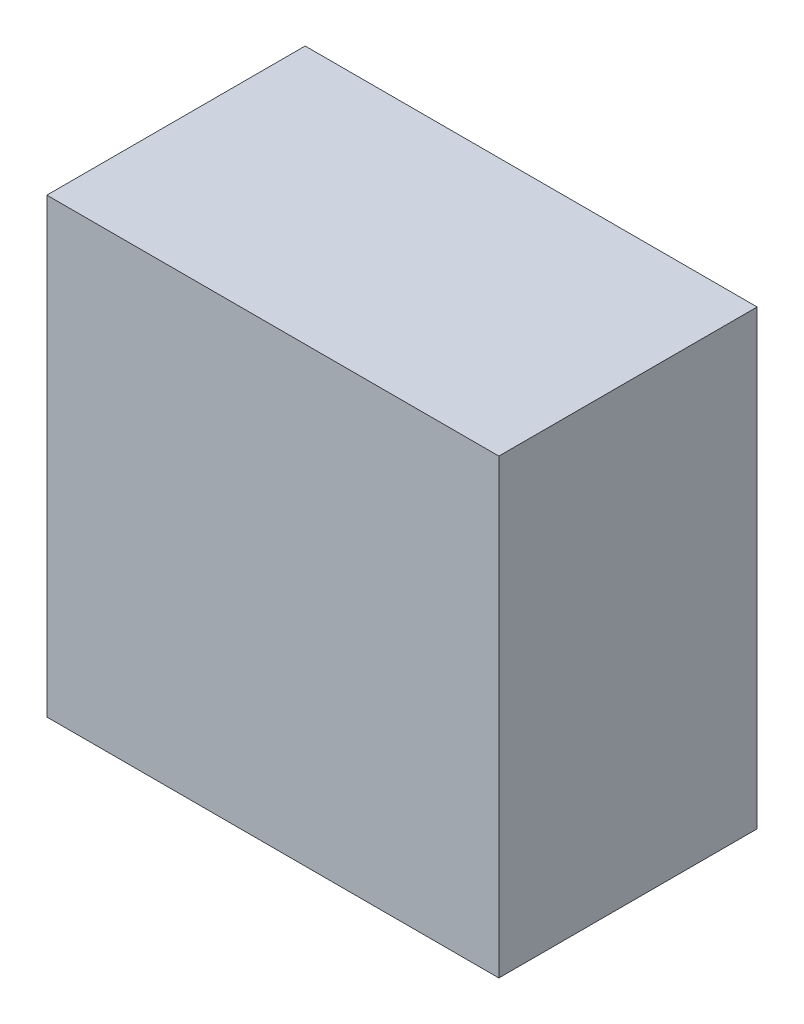
ISO-10303-21;
HEADER;
FILE_DESCRIPTION(('STEP AP214'),'2;1');
FILE_NAME('part.step','',(''),(''),'','','');
FILE_SCHEMA(('AUTOMOTIVE_DESIGN { 1 0 10303 214 1 1 1 1 }'));
ENDSEC;
DATA;
#1=APPLICATION_CONTEXT('core data for automotive mechanical design processes');
#2=APPLICATION_PROTOCOL_DEFINITION('international standard','automotive_design',2000,#1);
#3=PRODUCT_CONTEXT('',#1,'mechanical');
#4=PRODUCT('Part','Part','',(#3));
#5=PRODUCT_RELATED_PRODUCT_CATEGORY('part','',(#4));
#6=PRODUCT_DEFINITION_FORMATION('','',#4);
#7=PRODUCT_DEFINITION_CONTEXT('part definition',#1,'design');
#8=PRODUCT_DEFINITION('design','',#6,#7);
#9=PRODUCT_DEFINITION_SHAPE('','',#8);
#10=(LENGTH_UNIT() NAMED_UNIT(*) SI_UNIT(.MILLI.,.METRE.));
#11=(NAMED_UNIT(*) PLANE_ANGLE_UNIT() SI_UNIT($,.RADIAN.));
#12=(NAMED_UNIT(*) SI_UNIT($,.STERADIAN.) SOLID_ANGLE_UNIT());
#13=UNCERTAINTY_MEASURE_WITH_UNIT(LENGTH_MEASURE(1.E-05),#10,'distance_accuracy_value','');
#14=(GEOMETRIC_REPRESENTATION_CONTEXT(3) GLOBAL_UNCERTAINTY_ASSIGNED_CONTEXT((#13)) GLOBAL_UNIT_ASSIGNED_CONTEXT((#10,
#11,#12)) REPRESENTATION_CONTEXT('',''));
#15=CARTESIAN_POINT('',(0.,0.,0.));
#16=DIRECTION('',(0.,0.,1.));
#17=DIRECTION('',(1.,0.,0.));
#18=AXIS2_PLACEMENT_3D('',#15,#16,#17);
#19=CARTESIAN_POINT('',(-70.,70.,80.));
#20=DIRECTION('',(1.,0.,0.));
#21=DIRECTION('',(0.,0.,-1.));
#22=AXIS2_PLACEMENT_3D('',#19,#20,#21);
#23=PLANE('',#22);
#24=DIRECTION('',(0.,-1.,0.));
#25=VECTOR('',#24,1.);
#26=CARTESIAN_POINT('',(-70.,70.,0.));
#27=LINE('',#26,#25);
#28=CARTESIAN_POINT('',(-70.,70.,0.));
#29=VERTEX_POINT('',#28);
#30=CARTESIAN_POINT('',(-70.,-70.,0.));
#31=VERTEX_POINT('',#30);
#32=EDGE_CURVE('E83',#29,#31,#27,.T.);
#33=ORIENTED_EDGE('',*,*,#32,.T.);
#34=DIRECTION('',(0.,0.,-1.));
#35=VECTOR('',#34,1.);
#36=CARTESIAN_POINT('',(-70.,-70.,80.));
#37=LINE('',#36,#35);
#38=CARTESIAN_POINT('',(-70.,-70.,80.));
#39=VERTEX_POINT('',#38);
#40=EDGE_CURVE('E11',#39,#31,#37,.T.);
#41=ORIENTED_EDGE('',*,*,#40,.F.);
#42=DIRECTION('',(0.,-1.,0.));
#43=VECTOR('',#42,1.);
#44=CARTESIAN_POINT('',(-70.,70.,80.));
#45=LINE('',#44,#43);
#46=CARTESIAN_POINT('',(-70.,70.,80.));
#47=VERTEX_POINT('',#46);
#48=EDGE_CURVE('E69',#47,#39,#45,.T.);
#49=ORIENTED_EDGE('',*,*,#48,.F.);
#50=DIRECTION('',(0.,0.,-1.));
#51=VECTOR('',#50,1.);
#52=CARTESIAN_POINT('',(-70.,70.,80.));
#53=LINE('',#52,#51);
#54=EDGE_CURVE('E77',#47,#29,#53,.T.);
#55=ORIENTED_EDGE('',*,*,#54,.T.);
#56=EDGE_LOOP('',(#33,#41,#49,#55));
#57=FACE_BOUND('',#56,.T.);
#58=ADVANCED_FACE('F18',(#57),#23,.F.);
#59=CARTESIAN_POINT('',(-70.,-70.,80.));
#60=DIRECTION('',(0.,1.,0.));
#61=DIRECTION('',(0.,0.,1.));
#62=AXIS2_PLACEMENT_3D('',#59,#60,#61);
#63=PLANE('',#62);
#64=DIRECTION('',(1.,0.,0.));
#65=VECTOR('',#64,1.);
#66=CARTESIAN_POINT('',(-70.,-70.,0.));
#67=LINE('',#66,#65);
#68=CARTESIAN_POINT('',(70.,-70.,0.));
#69=VERTEX_POINT('',#68);
#70=EDGE_CURVE('E73',#31,#69,#67,.T.);
#71=ORIENTED_EDGE('',*,*,#70,.T.);
#72=DIRECTION('',(0.,0.,-1.));
#73=VECTOR('',#72,1.);
#74=CARTESIAN_POINT('',(70.,-70.,80.));
#75=LINE('',#74,#73);
#76=CARTESIAN_POINT('',(70.,-70.,80.));
#77=VERTEX_POINT('',#76);
#78=EDGE_CURVE('E26',#77,#69,#75,.T.);
#79=ORIENTED_EDGE('',*,*,#78,.F.);
#80=DIRECTION('',(1.,0.,0.));
#81=VECTOR('',#80,1.);
#82=CARTESIAN_POINT('',(-70.,-70.,80.));
#83=LINE('',#82,#81);
#84=EDGE_CURVE('E64',#39,#77,#83,.T.);
#85=ORIENTED_EDGE('',*,*,#84,.F.);
#86=ORIENTED_EDGE('',*,*,#40,.T.);
#87=EDGE_LOOP('',(#71,#79,#85,#86));
#88=FACE_BOUND('',#87,.T.);
#89=ADVANCED_FACE('F72',(#88),#63,.F.);
#90=CARTESIAN_POINT('',(70.,-70.,80.));
#91=DIRECTION('',(-1.,0.,0.));
#92=DIRECTION('',(0.,-1.,0.));
#93=AXIS2_PLACEMENT_3D('',#90,#91,#92);
#94=PLANE('',#93);
#95=DIRECTION('',(0.,1.,0.));
#96=VECTOR('',#95,1.);
#97=CARTESIAN_POINT('',(70.,-70.,0.));
#98=LINE('',#97,#96);
#99=CARTESIAN_POINT('',(70.,70.,0.));
#100=VERTEX_POINT('',#99);
#101=EDGE_CURVE('E51',#69,#100,#98,.T.);
#102=ORIENTED_EDGE('',*,*,#101,.T.);
#103=DIRECTION('',(0.,0.,-1.));
#104=VECTOR('',#103,1.);
#105=CARTESIAN_POINT('',(70.,70.,80.));
#106=LINE('',#105,#104);
#107=CARTESIAN_POINT('',(70.,70.,80.));
#108=VERTEX_POINT('',#107);
#109=EDGE_CURVE('E74',#108,#100,#106,.T.);
#110=ORIENTED_EDGE('',*,*,#109,.F.);
#111=DIRECTION('',(0.,1.,0.));
#112=VECTOR('',#111,1.);
#113=CARTESIAN_POINT('',(70.,-70.,80.));
#114=LINE('',#113,#112);
#115=EDGE_CURVE('E67',#77,#108,#114,.T.);
#116=ORIENTED_EDGE('',*,*,#115,.F.);
#117=ORIENTED_EDGE('',*,*,#78,.T.);
#118=EDGE_LOOP('',(#102,#110,#116,#117));
#119=FACE_BOUND('',#118,.T.);
#120=ADVANCED_FACE('F75',(#119),#94,.F.);
#121=CARTESIAN_POINT('',(70.,70.,80.));
#122=DIRECTION('',(0.,-1.,0.));
#123=DIRECTION('',(0.,0.,-1.));
#124=AXIS2_PLACEMENT_3D('',#121,#122,#123);
#125=PLANE('',#124);
#126=DIRECTION('',(-1.,0.,0.));
#127=VECTOR('',#126,1.);
#128=CARTESIAN_POINT('',(70.,70.,0.));
#129=LINE('',#128,#127);
#130=EDGE_CURVE('E57',#100,#29,#129,.T.);
#131=ORIENTED_EDGE('',*,*,#130,.T.);
#132=ORIENTED_EDGE('',*,*,#54,.F.);
#133=DIRECTION('',(-1.,0.,0.));
#134=VECTOR('',#133,1.);
#135=CARTESIAN_POINT('',(70.,70.,80.));
#136=LINE('',#135,#134);
#137=EDGE_CURVE('E34',#108,#47,#136,.T.);
#138=ORIENTED_EDGE('',*,*,#137,.F.);
#139=ORIENTED_EDGE('',*,*,#109,.T.);
#140=EDGE_LOOP('',(#131,#132,#138,#139));
#141=FACE_BOUND('',#140,.T.);
#142=ADVANCED_FACE('F92',(#141),#125,.F.);
#143=CARTESIAN_POINT('',(-70.,-70.,80.));
#144=DIRECTION('',(0.,0.,1.));
#145=DIRECTION('',(1.,0.,0.));
#146=AXIS2_PLACEMENT_3D('',#143,#144,#145);
#147=PLANE('',#146);
#148=ORIENTED_EDGE('',*,*,#48,.T.);
#149=ORIENTED_EDGE('',*,*,#84,.T.);
#150=ORIENTED_EDGE('',*,*,#115,.T.);
#151=ORIENTED_EDGE('',*,*,#137,.T.);
#152=EDGE_LOOP('',(#148,#149,#150,#151));
#153=FACE_BOUND('',#152,.T.);
#154=ADVANCED_FACE('F65',(#153),#147,.T.);
#155=CARTESIAN_POINT('',(-70.,-70.,0.));
#156=DIRECTION('',(0.,0.,1.));
#157=DIRECTION('',(1.,0.,0.));
#158=AXIS2_PLACEMENT_3D('',#155,#156,#157);
#159=PLANE('',#158);
#160=ORIENTED_EDGE('',*,*,#32,.F.);
#161=ORIENTED_EDGE('',*,*,#130,.F.);
#162=ORIENTED_EDGE('',*,*,#101,.F.);
#163=ORIENTED_EDGE('',*,*,#70,.F.);
#164=EDGE_LOOP('',(#160,#161,#162,#163));
#165=FACE_BOUND('',#164,.T.);
#166=ADVANCED_FACE('F95',(#165),#159,.F.);
#167=CLOSED_SHELL('',(#58,#89,#120,#142,#154,#166));
#168=MANIFOLD_SOLID_BREP('B1',#167);
#169=ADVANCED_BREP_SHAPE_REPRESENTATION('',(#18,#168),#14);
#170=SHAPE_DEFINITION_REPRESENTATION(#9,#169);
ENDSEC;
END-ISO-10303-21;
